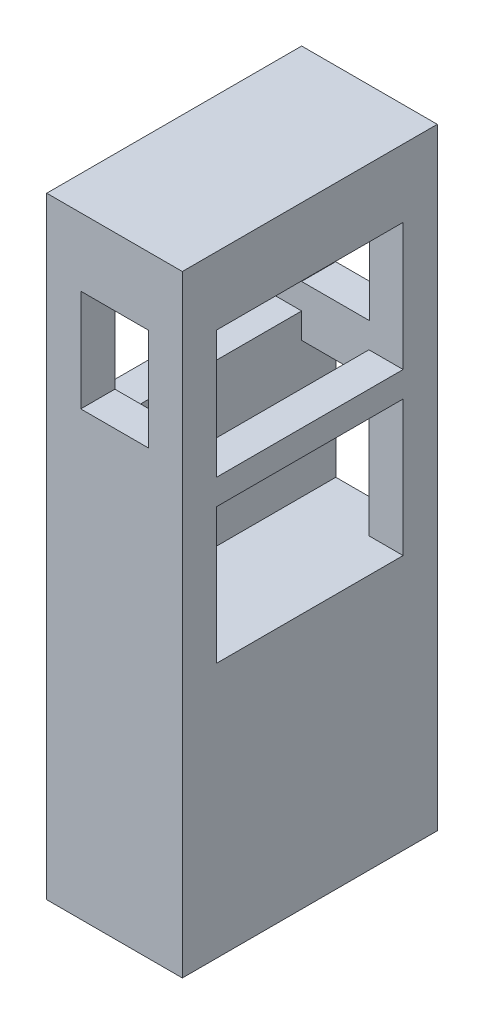
ISO-10303-21;
HEADER;
FILE_DESCRIPTION(('STEP AP214'),'2;1');
FILE_NAME('part.step','',(''),(''),'','','');
FILE_SCHEMA(('AUTOMOTIVE_DESIGN { 1 0 10303 214 1 1 1 1 }'));
ENDSEC;
DATA;
#1=APPLICATION_CONTEXT('core data for automotive mechanical design processes');
#2=APPLICATION_PROTOCOL_DEFINITION('international standard','automotive_design',2000,#1);
#3=PRODUCT_CONTEXT('',#1,'mechanical');
#4=PRODUCT('Part','Part','',(#3));
#5=PRODUCT_RELATED_PRODUCT_CATEGORY('part','',(#4));
#6=PRODUCT_DEFINITION_FORMATION('','',#4);
#7=PRODUCT_DEFINITION_CONTEXT('part definition',#1,'design');
#8=PRODUCT_DEFINITION('design','',#6,#7);
#9=PRODUCT_DEFINITION_SHAPE('','',#8);
#10=(LENGTH_UNIT() NAMED_UNIT(*) SI_UNIT(.MILLI.,.METRE.));
#11=(NAMED_UNIT(*) PLANE_ANGLE_UNIT() SI_UNIT($,.RADIAN.));
#12=(NAMED_UNIT(*) SI_UNIT($,.STERADIAN.) SOLID_ANGLE_UNIT());
#13=UNCERTAINTY_MEASURE_WITH_UNIT(LENGTH_MEASURE(1.E-05),#10,'distance_accuracy_value','');
#14=(GEOMETRIC_REPRESENTATION_CONTEXT(3) GLOBAL_UNCERTAINTY_ASSIGNED_CONTEXT((#13)) GLOBAL_UNIT_ASSIGNED_CONTEXT((#10,
#11,#12)) REPRESENTATION_CONTEXT('',''));
#15=CARTESIAN_POINT('',(0.,0.,0.));
#16=DIRECTION('',(0.,0.,1.));
#17=DIRECTION('',(1.,0.,0.));
#18=AXIS2_PLACEMENT_3D('',#15,#16,#17);
#19=CARTESIAN_POINT('',(667.5,10670.,0.));
#20=DIRECTION('',(0.,1.,0.));
#21=DIRECTION('',(0.,0.,1.));
#22=AXIS2_PLACEMENT_3D('',#19,#20,#21);
#23=PLANE('',#22);
#24=DIRECTION('',(-1.,0.,0.));
#25=VECTOR('',#24,1.);
#26=CARTESIAN_POINT('',(2460.,10670.,670.000000000001));
#27=LINE('',#26,#25);
#28=CARTESIAN_POINT('',(1997.5,10670.,670.000000000001));
#29=VERTEX_POINT('',#28);
#30=CARTESIAN_POINT('',(667.5,10670.,670.000000000001));
#31=VERTEX_POINT('',#30);
#32=EDGE_CURVE('E282',#29,#31,#27,.T.);
#33=ORIENTED_EDGE('',*,*,#32,.T.);
#34=DIRECTION('',(0.,0.,1.));
#35=VECTOR('',#34,1.);
#36=CARTESIAN_POINT('',(667.5,10670.,0.));
#37=LINE('',#36,#35);
#38=CARTESIAN_POINT('',(667.5,10670.,0.));
#39=VERTEX_POINT('',#38);
#40=EDGE_CURVE('E446',#39,#31,#37,.T.);
#41=ORIENTED_EDGE('',*,*,#40,.F.);
#42=DIRECTION('',(-1.,0.,0.));
#43=VECTOR('',#42,1.);
#44=CARTESIAN_POINT('',(667.5,10670.,0.));
#45=LINE('',#44,#43);
#46=CARTESIAN_POINT('',(1997.5,10670.,0.));
#47=VERTEX_POINT('',#46);
#48=EDGE_CURVE('E432',#47,#39,#45,.T.);
#49=ORIENTED_EDGE('',*,*,#48,.F.);
#50=DIRECTION('',(0.,0.,1.));
#51=VECTOR('',#50,1.);
#52=CARTESIAN_POINT('',(1997.5,10670.,0.));
#53=LINE('',#52,#51);
#54=EDGE_CURVE('E451',#47,#29,#53,.T.);
#55=ORIENTED_EDGE('',*,*,#54,.T.);
#56=EDGE_LOOP('',(#33,#41,#49,#55));
#57=FACE_BOUND('',#56,.T.);
#58=ADVANCED_FACE('F35',(#57),#23,.F.);
#59=DIRECTION('',(1.,0.,0.));
#60=VECTOR('',#59,1.);
#61=CARTESIAN_POINT('',(0.,10670.,670.000000000001));
#62=LINE('',#61,#60);
#63=CARTESIAN_POINT('',(0.,10670.,670.000000000001));
#64=VERTEX_POINT('',#63);
#65=CARTESIAN_POINT('',(200.,10670.,670.000000000001));
#66=VERTEX_POINT('',#65);
#67=EDGE_CURVE('E404',#64,#66,#62,.T.);
#68=ORIENTED_EDGE('',*,*,#67,.T.);
#69=DIRECTION('',(0.,0.,-1.));
#70=VECTOR('',#69,1.);
#71=CARTESIAN_POINT('',(200.,10670.,4330.));
#72=LINE('',#71,#70);
#73=CARTESIAN_POINT('',(200.,10670.,4330.));
#74=VERTEX_POINT('',#73);
#75=EDGE_CURVE('E298',#74,#66,#72,.T.);
#76=ORIENTED_EDGE('',*,*,#75,.F.);
#77=DIRECTION('',(1.,0.,0.));
#78=VECTOR('',#77,1.);
#79=CARTESIAN_POINT('',(0.,10670.,4330.));
#80=LINE('',#79,#78);
#81=CARTESIAN_POINT('',(0.,10670.,4330.));
#82=VERTEX_POINT('',#81);
#83=EDGE_CURVE('E400',#82,#74,#80,.T.);
#84=ORIENTED_EDGE('',*,*,#83,.F.);
#85=DIRECTION('',(0.,0.,-1.));
#86=VECTOR('',#85,1.);
#87=CARTESIAN_POINT('',(0.,10670.,4330.));
#88=LINE('',#87,#86);
#89=EDGE_CURVE('E378',#82,#64,#88,.T.);
#90=ORIENTED_EDGE('',*,*,#89,.T.);
#91=EDGE_LOOP('',(#68,#76,#84,#90));
#92=FACE_BOUND('',#91,.T.);
#93=ADVANCED_FACE('F529',(#92),#23,.F.);
#94=DIRECTION('',(0.,0.,-1.));
#95=VECTOR('',#94,1.);
#96=CARTESIAN_POINT('',(2460.,10670.,4330.));
#97=LINE('',#96,#95);
#98=CARTESIAN_POINT('',(2460.,10670.,4330.));
#99=VERTEX_POINT('',#98);
#100=CARTESIAN_POINT('',(2460.,10670.,670.000000000001));
#101=VERTEX_POINT('',#100);
#102=EDGE_CURVE('E58',#99,#101,#97,.T.);
#103=ORIENTED_EDGE('',*,*,#102,.T.);
#104=CARTESIAN_POINT('',(2660.,10670.,670.000000000001));
#105=VERTEX_POINT('',#104);
#106=EDGE_CURVE('E407',#101,#105,#62,.T.);
#107=ORIENTED_EDGE('',*,*,#106,.T.);
#108=DIRECTION('',(0.,0.,-1.));
#109=VECTOR('',#108,1.);
#110=CARTESIAN_POINT('',(2660.,10670.,4330.));
#111=LINE('',#110,#109);
#112=CARTESIAN_POINT('',(2660.,10670.,4330.));
#113=VERTEX_POINT('',#112);
#114=EDGE_CURVE('E390',#113,#105,#111,.T.);
#115=ORIENTED_EDGE('',*,*,#114,.F.);
#116=EDGE_CURVE('E403',#99,#113,#80,.T.);
#117=ORIENTED_EDGE('',*,*,#116,.F.);
#118=EDGE_LOOP('',(#103,#107,#115,#117));
#119=FACE_BOUND('',#118,.T.);
#120=ADVANCED_FACE('F518',(#119),#23,.F.);
#121=CARTESIAN_POINT('',(1990.,5510.,4330.));
#122=DIRECTION('',(1.,0.,0.));
#123=DIRECTION('',(0.,0.,-1.));
#124=AXIS2_PLACEMENT_3D('',#121,#122,#123);
#125=PLANE('',#124);
#126=DIRECTION('',(0.,1.,0.));
#127=VECTOR('',#126,1.);
#128=CARTESIAN_POINT('',(1990.,5510.,670.));
#129=LINE('',#128,#127);
#130=CARTESIAN_POINT('',(1990.,7670.,670.000000000001));
#131=VERTEX_POINT('',#130);
#132=CARTESIAN_POINT('',(1990.,8170.,670.));
#133=VERTEX_POINT('',#132);
#134=EDGE_CURVE('E363',#131,#133,#129,.T.);
#135=ORIENTED_EDGE('',*,*,#134,.F.);
#136=DIRECTION('',(0.,0.,1.));
#137=VECTOR('',#136,1.);
#138=CARTESIAN_POINT('',(1990.,7670.,670.000000000001));
#139=LINE('',#138,#137);
#140=CARTESIAN_POINT('',(1990.,7670.,4330.));
#141=VERTEX_POINT('',#140);
#142=EDGE_CURVE('E317',#131,#141,#139,.T.);
#143=ORIENTED_EDGE('',*,*,#142,.T.);
#144=DIRECTION('',(0.,1.,0.));
#145=VECTOR('',#144,1.);
#146=CARTESIAN_POINT('',(1990.,5510.,4330.));
#147=LINE('',#146,#145);
#148=CARTESIAN_POINT('',(1990.,8170.,4330.));
#149=VERTEX_POINT('',#148);
#150=EDGE_CURVE('E364',#141,#149,#147,.T.);
#151=ORIENTED_EDGE('',*,*,#150,.T.);
#152=DIRECTION('',(0.,0.,-1.));
#153=VECTOR('',#152,1.);
#154=CARTESIAN_POINT('',(1990.,8170.,4330.));
#155=LINE('',#154,#153);
#156=EDGE_CURVE('E357',#149,#133,#155,.T.);
#157=ORIENTED_EDGE('',*,*,#156,.T.);
#158=EDGE_LOOP('',(#135,#143,#151,#157));
#159=FACE_BOUND('',#158,.T.);
#160=ADVANCED_FACE('F532',(#159),#125,.F.);
#161=CARTESIAN_POINT('',(1990.,5010.,-1.2E-05));
#162=DIRECTION('',(0.,1.,0.));
#163=DIRECTION('',(0.,0.,1.));
#164=AXIS2_PLACEMENT_3D('',#161,#162,#163);
#165=PLANE('',#164);
#166=DIRECTION('',(-1.,0.,0.));
#167=VECTOR('',#166,1.);
#168=CARTESIAN_POINT('',(1990.,5010.,4330.));
#169=LINE('',#168,#167);
#170=CARTESIAN_POINT('',(2660.,5010.,4330.));
#171=VERTEX_POINT('',#170);
#172=CARTESIAN_POINT('',(670.,5010.,4330.));
#173=VERTEX_POINT('',#172);
#174=EDGE_CURVE('E341',#171,#173,#169,.T.);
#175=ORIENTED_EDGE('',*,*,#174,.F.);
#176=DIRECTION('',(0.,0.,1.));
#177=VECTOR('',#176,1.);
#178=CARTESIAN_POINT('',(2660.,5010.,670.000000000001));
#179=LINE('',#178,#177);
#180=CARTESIAN_POINT('',(2660.,5010.,670.000000000001));
#181=VERTEX_POINT('',#180);
#182=EDGE_CURVE('E327',#181,#171,#179,.T.);
#183=ORIENTED_EDGE('',*,*,#182,.F.);
#184=DIRECTION('',(1.,0.,0.));
#185=VECTOR('',#184,1.);
#186=CARTESIAN_POINT('',(1990.,5010.,670.000000000001));
#187=LINE('',#186,#185);
#188=CARTESIAN_POINT('',(1990.,5010.,670.000000000001));
#189=VERTEX_POINT('',#188);
#190=EDGE_CURVE('E324',#189,#181,#187,.T.);
#191=ORIENTED_EDGE('',*,*,#190,.F.);
#192=DIRECTION('',(0.,0.,1.));
#193=VECTOR('',#192,1.);
#194=CARTESIAN_POINT('',(1990.,5010.,-1.2E-05));
#195=LINE('',#194,#193);
#196=CARTESIAN_POINT('',(1990.,5010.,0.));
#197=VERTEX_POINT('',#196);
#198=EDGE_CURVE('E347',#197,#189,#195,.T.);
#199=ORIENTED_EDGE('',*,*,#198,.F.);
#200=DIRECTION('',(-1.,0.,0.));
#201=VECTOR('',#200,1.);
#202=CARTESIAN_POINT('',(0.,5010.,0.));
#203=LINE('',#202,#201);
#204=CARTESIAN_POINT('',(670.,5010.,0.));
#205=VERTEX_POINT('',#204);
#206=EDGE_CURVE('E11',#197,#205,#203,.T.);
#207=ORIENTED_EDGE('',*,*,#206,.T.);
#208=DIRECTION('',(0.,0.,-1.));
#209=VECTOR('',#208,1.);
#210=CARTESIAN_POINT('',(670.,5010.,4268.99999999999));
#211=LINE('',#210,#209);
#212=EDGE_CURVE('E334',#173,#205,#211,.T.);
#213=ORIENTED_EDGE('',*,*,#212,.F.);
#214=EDGE_LOOP('',(#175,#183,#191,#199,#207,#213));
#215=FACE_BOUND('',#214,.T.);
#216=ADVANCED_FACE('F538',(#215),#165,.T.);
#217=CARTESIAN_POINT('',(0.,0.,0.));
#218=DIRECTION('',(0.,0.,1.));
#219=DIRECTION('',(1.,0.,0.));
#220=AXIS2_PLACEMENT_3D('',#217,#218,#219);
#221=PLANE('',#220);
#222=DIRECTION('',(1.,0.,0.));
#223=VECTOR('',#222,1.);
#224=CARTESIAN_POINT('',(0.,12000.,0.));
#225=LINE('',#224,#223);
#226=CARTESIAN_POINT('',(0.,12000.,0.));
#227=VERTEX_POINT('',#226);
#228=CARTESIAN_POINT('',(2660.,12000.,0.));
#229=VERTEX_POINT('',#228);
#230=EDGE_CURVE('E449',#227,#229,#225,.T.);
#231=ORIENTED_EDGE('',*,*,#230,.T.);
#232=DIRECTION('',(0.,1.,0.));
#233=VECTOR('',#232,1.);
#234=CARTESIAN_POINT('',(2660.,0.,0.));
#235=LINE('',#234,#233);
#236=CARTESIAN_POINT('',(2660.,0.,0.));
#237=VERTEX_POINT('',#236);
#238=EDGE_CURVE('E476',#237,#229,#235,.T.);
#239=ORIENTED_EDGE('',*,*,#238,.F.);
#240=DIRECTION('',(1.,0.,0.));
#241=VECTOR('',#240,1.);
#242=CARTESIAN_POINT('',(0.,0.,0.));
#243=LINE('',#242,#241);
#244=CARTESIAN_POINT('',(0.,0.,0.));
#245=VERTEX_POINT('',#244);
#246=EDGE_CURVE('E479',#245,#237,#243,.T.);
#247=ORIENTED_EDGE('',*,*,#246,.F.);
#248=DIRECTION('',(0.,1.,0.));
#249=VECTOR('',#248,1.);
#250=CARTESIAN_POINT('',(0.,0.,0.));
#251=LINE('',#250,#249);
#252=EDGE_CURVE('E466',#245,#227,#251,.T.);
#253=ORIENTED_EDGE('',*,*,#252,.T.);
#254=EDGE_LOOP('',(#231,#239,#247,#253));
#255=FACE_BOUND('',#254,.T.);
#256=ORIENTED_EDGE('',*,*,#48,.T.);
#257=DIRECTION('',(0.,-1.,0.));
#258=VECTOR('',#257,1.);
#259=CARTESIAN_POINT('',(667.5,10670.,0.));
#260=LINE('',#259,#258);
#261=CARTESIAN_POINT('',(667.5,8670.,0.));
#262=VERTEX_POINT('',#261);
#263=EDGE_CURVE('E422',#39,#262,#260,.T.);
#264=ORIENTED_EDGE('',*,*,#263,.T.);
#265=DIRECTION('',(1.,0.,0.));
#266=VECTOR('',#265,1.);
#267=CARTESIAN_POINT('',(667.5,8670.,0.));
#268=LINE('',#267,#266);
#269=CARTESIAN_POINT('',(1997.5,8670.,0.));
#270=VERTEX_POINT('',#269);
#271=EDGE_CURVE('E425',#262,#270,#268,.T.);
#272=ORIENTED_EDGE('',*,*,#271,.T.);
#273=DIRECTION('',(0.,1.,0.));
#274=VECTOR('',#273,1.);
#275=CARTESIAN_POINT('',(1997.5,10670.,0.));
#276=LINE('',#275,#274);
#277=EDGE_CURVE('E429',#270,#47,#276,.T.);
#278=ORIENTED_EDGE('',*,*,#277,.T.);
#279=EDGE_LOOP('',(#256,#264,#272,#278));
#280=FACE_BOUND('',#279,.T.);
#281=DIRECTION('',(0.,-1.,0.));
#282=VECTOR('',#281,1.);
#283=CARTESIAN_POINT('',(1990.,-1.66116076616847E-13,0.));
#284=LINE('',#283,#282);
#285=CARTESIAN_POINT('',(1990.,7670.,0.));
#286=VERTEX_POINT('',#285);
#287=EDGE_CURVE('E350',#286,#197,#284,.T.);
#288=ORIENTED_EDGE('',*,*,#287,.F.);
#289=DIRECTION('',(1.,0.,0.));
#290=VECTOR('',#289,1.);
#291=CARTESIAN_POINT('',(0.,7670.,0.));
#292=LINE('',#291,#290);
#293=CARTESIAN_POINT('',(670.,7670.,0.));
#294=VERTEX_POINT('',#293);
#295=EDGE_CURVE('E355',#294,#286,#292,.T.);
#296=ORIENTED_EDGE('',*,*,#295,.F.);
#297=DIRECTION('',(0.,1.,0.));
#298=VECTOR('',#297,1.);
#299=CARTESIAN_POINT('',(670.,7670.,0.));
#300=LINE('',#299,#298);
#301=EDGE_CURVE('E337',#205,#294,#300,.T.);
#302=ORIENTED_EDGE('',*,*,#301,.F.);
#303=ORIENTED_EDGE('',*,*,#206,.F.);
#304=EDGE_LOOP('',(#288,#296,#302,#303));
#305=FACE_BOUND('',#304,.T.);
#306=ADVANCED_FACE('F615',(#255,#280,#305),#221,.F.);
#307=CARTESIAN_POINT('',(0.,10670.,670.000000000001));
#308=DIRECTION('',(0.,0.,1.));
#309=DIRECTION('',(0.,-1.,0.));
#310=AXIS2_PLACEMENT_3D('',#307,#308,#309);
#311=PLANE('',#310);
#312=DIRECTION('',(0.,-1.,0.));
#313=VECTOR('',#312,1.);
#314=CARTESIAN_POINT('',(200.,11670.,670.000000000001));
#315=LINE('',#314,#313);
#316=CARTESIAN_POINT('',(200.,11670.,670.000000000001));
#317=VERTEX_POINT('',#316);
#318=EDGE_CURVE('E309',#317,#66,#315,.T.);
#319=ORIENTED_EDGE('',*,*,#318,.T.);
#320=ORIENTED_EDGE('',*,*,#67,.F.);
#321=DIRECTION('',(0.,-1.,0.));
#322=VECTOR('',#321,1.);
#323=CARTESIAN_POINT('',(0.,10670.,670.000000000001));
#324=LINE('',#323,#322);
#325=CARTESIAN_POINT('',(0.,8170.,670.));
#326=VERTEX_POINT('',#325);
#327=EDGE_CURVE('E375',#64,#326,#324,.T.);
#328=ORIENTED_EDGE('',*,*,#327,.T.);
#329=DIRECTION('',(1.,0.,0.));
#330=VECTOR('',#329,1.);
#331=CARTESIAN_POINT('',(0.,8170.,670.));
#332=LINE('',#331,#330);
#333=CARTESIAN_POINT('',(670.,8170.,670.));
#334=VERTEX_POINT('',#333);
#335=EDGE_CURVE('E408',#326,#334,#332,.T.);
#336=ORIENTED_EDGE('',*,*,#335,.T.);
#337=DIRECTION('',(0.,1.,0.));
#338=VECTOR('',#337,1.);
#339=CARTESIAN_POINT('',(670.,5510.,670.));
#340=LINE('',#339,#338);
#341=CARTESIAN_POINT('',(670.,7670.,670.));
#342=VERTEX_POINT('',#341);
#343=EDGE_CURVE('E369',#342,#334,#340,.T.);
#344=ORIENTED_EDGE('',*,*,#343,.F.);
#345=DIRECTION('',(1.,0.,0.));
#346=VECTOR('',#345,1.);
#347=CARTESIAN_POINT('',(0.,7670.,670.));
#348=LINE('',#347,#346);
#349=EDGE_CURVE('E352',#342,#131,#348,.T.);
#350=ORIENTED_EDGE('',*,*,#349,.T.);
#351=ORIENTED_EDGE('',*,*,#134,.T.);
#352=CARTESIAN_POINT('',(2660.,8170.,670.));
#353=VERTEX_POINT('',#352);
#354=EDGE_CURVE('E384',#133,#353,#332,.T.);
#355=ORIENTED_EDGE('',*,*,#354,.T.);
#356=DIRECTION('',(0.,-1.,0.));
#357=VECTOR('',#356,1.);
#358=CARTESIAN_POINT('',(2660.,10670.,670.000000000001));
#359=LINE('',#358,#357);
#360=EDGE_CURVE('E387',#105,#353,#359,.T.);
#361=ORIENTED_EDGE('',*,*,#360,.F.);
#362=ORIENTED_EDGE('',*,*,#106,.F.);
#363=DIRECTION('',(0.,-1.,0.));
#364=VECTOR('',#363,1.);
#365=CARTESIAN_POINT('',(2460.,11670.,670.000000000001));
#366=LINE('',#365,#364);
#367=CARTESIAN_POINT('',(2460.,11670.,670.000000000001));
#368=VERTEX_POINT('',#367);
#369=EDGE_CURVE('E296',#368,#101,#366,.T.);
#370=ORIENTED_EDGE('',*,*,#369,.F.);
#371=DIRECTION('',(-1.,0.,0.));
#372=VECTOR('',#371,1.);
#373=CARTESIAN_POINT('',(2460.,11670.,670.000000000001));
#374=LINE('',#373,#372);
#375=EDGE_CURVE('E286',#368,#317,#374,.T.);
#376=ORIENTED_EDGE('',*,*,#375,.T.);
#377=EDGE_LOOP('',(#319,#320,#328,#336,#344,#350,#351,#355,#361,#362,#370,#376));
#378=FACE_BOUND('',#377,.T.);
#379=DIRECTION('',(0.,1.,0.));
#380=VECTOR('',#379,1.);
#381=CARTESIAN_POINT('',(667.5,10670.,670.000000000001));
#382=LINE('',#381,#380);
#383=CARTESIAN_POINT('',(667.5,8670.,670.));
#384=VERTEX_POINT('',#383);
#385=EDGE_CURVE('E412',#384,#31,#382,.T.);
#386=ORIENTED_EDGE('',*,*,#385,.T.);
#387=ORIENTED_EDGE('',*,*,#32,.F.);
#388=DIRECTION('',(0.,-1.,0.));
#389=VECTOR('',#388,1.);
#390=CARTESIAN_POINT('',(1997.5,10670.,670.000000000001));
#391=LINE('',#390,#389);
#392=CARTESIAN_POINT('',(1997.5,8670.,670.));
#393=VERTEX_POINT('',#392);
#394=EDGE_CURVE('E398',#29,#393,#391,.T.);
#395=ORIENTED_EDGE('',*,*,#394,.T.);
#396=DIRECTION('',(-1.,0.,0.));
#397=VECTOR('',#396,1.);
#398=CARTESIAN_POINT('',(667.5,8670.,670.));
#399=LINE('',#398,#397);
#400=EDGE_CURVE('E485',#393,#384,#399,.T.);
#401=ORIENTED_EDGE('',*,*,#400,.T.);
#402=EDGE_LOOP('',(#386,#387,#395,#401));
#403=FACE_BOUND('',#402,.T.);
#404=ADVANCED_FACE('F549',(#378,#403),#311,.T.);
#405=CARTESIAN_POINT('',(670.,5510.,4330.));
#406=DIRECTION('',(-1.,0.,0.));
#407=DIRECTION('',(0.,0.,1.));
#408=AXIS2_PLACEMENT_3D('',#405,#406,#407);
#409=PLANE('',#408);
#410=DIRECTION('',(0.,1.,0.));
#411=VECTOR('',#410,1.);
#412=CARTESIAN_POINT('',(670.,5510.,4330.));
#413=LINE('',#412,#411);
#414=CARTESIAN_POINT('',(670.,8170.,4330.));
#415=VERTEX_POINT('',#414);
#416=EDGE_CURVE('E367',#173,#415,#413,.T.);
#417=ORIENTED_EDGE('',*,*,#416,.F.);
#418=ORIENTED_EDGE('',*,*,#212,.T.);
#419=ORIENTED_EDGE('',*,*,#301,.T.);
#420=DIRECTION('',(0.,0.,1.));
#421=VECTOR('',#420,1.);
#422=CARTESIAN_POINT('',(670.,7670.,4268.99999999999));
#423=LINE('',#422,#421);
#424=EDGE_CURVE('E339',#294,#342,#423,.T.);
#425=ORIENTED_EDGE('',*,*,#424,.T.);
#426=ORIENTED_EDGE('',*,*,#343,.T.);
#427=DIRECTION('',(0.,0.,1.));
#428=VECTOR('',#427,1.);
#429=CARTESIAN_POINT('',(670.,8170.,4330.));
#430=LINE('',#429,#428);
#431=EDGE_CURVE('E360',#334,#415,#430,.T.);
#432=ORIENTED_EDGE('',*,*,#431,.T.);
#433=EDGE_LOOP('',(#417,#418,#419,#425,#426,#432));
#434=FACE_BOUND('',#433,.T.);
#435=ADVANCED_FACE('F584',(#434),#409,.F.);
#436=CARTESIAN_POINT('',(0.,8170.,4330.));
#437=DIRECTION('',(0.,-1.,0.));
#438=DIRECTION('',(0.,0.,-1.));
#439=AXIS2_PLACEMENT_3D('',#436,#437,#438);
#440=PLANE('',#439);
#441=ORIENTED_EDGE('',*,*,#354,.F.);
#442=ORIENTED_EDGE('',*,*,#156,.F.);
#443=DIRECTION('',(1.,0.,0.));
#444=VECTOR('',#443,1.);
#445=CARTESIAN_POINT('',(0.,8170.,4330.));
#446=LINE('',#445,#444);
#447=CARTESIAN_POINT('',(2660.,8170.,4330.));
#448=VERTEX_POINT('',#447);
#449=EDGE_CURVE('E399',#149,#448,#446,.T.);
#450=ORIENTED_EDGE('',*,*,#449,.T.);
#451=DIRECTION('',(0.,0.,-1.));
#452=VECTOR('',#451,1.);
#453=CARTESIAN_POINT('',(2660.,8170.,4330.));
#454=LINE('',#453,#452);
#455=EDGE_CURVE('E366',#448,#353,#454,.T.);
#456=ORIENTED_EDGE('',*,*,#455,.T.);
#457=EDGE_LOOP('',(#441,#442,#450,#456));
#458=FACE_BOUND('',#457,.T.);
#459=ADVANCED_FACE('F592',(#458),#440,.F.);
#460=CARTESIAN_POINT('',(667.5,10670.,0.));
#461=DIRECTION('',(-1.,0.,0.));
#462=DIRECTION('',(0.,-1.,0.));
#463=AXIS2_PLACEMENT_3D('',#460,#461,#462);
#464=PLANE('',#463);
#465=ORIENTED_EDGE('',*,*,#385,.F.);
#466=DIRECTION('',(0.,0.,1.));
#467=VECTOR('',#466,1.);
#468=CARTESIAN_POINT('',(667.5,8670.,0.));
#469=LINE('',#468,#467);
#470=EDGE_CURVE('E459',#262,#384,#469,.T.);
#471=ORIENTED_EDGE('',*,*,#470,.F.);
#472=ORIENTED_EDGE('',*,*,#263,.F.);
#473=ORIENTED_EDGE('',*,*,#40,.T.);
#474=EDGE_LOOP('',(#465,#471,#472,#473));
#475=FACE_BOUND('',#474,.T.);
#476=ADVANCED_FACE('F526',(#475),#464,.F.);
#477=CARTESIAN_POINT('',(1997.5,10670.,0.));
#478=DIRECTION('',(1.,0.,0.));
#479=DIRECTION('',(0.,1.,0.));
#480=AXIS2_PLACEMENT_3D('',#477,#478,#479);
#481=PLANE('',#480);
#482=ORIENTED_EDGE('',*,*,#394,.F.);
#483=ORIENTED_EDGE('',*,*,#54,.F.);
#484=ORIENTED_EDGE('',*,*,#277,.F.);
#485=DIRECTION('',(0.,0.,1.));
#486=VECTOR('',#485,1.);
#487=CARTESIAN_POINT('',(1997.5,8670.,0.));
#488=LINE('',#487,#486);
#489=EDGE_CURVE('E455',#270,#393,#488,.T.);
#490=ORIENTED_EDGE('',*,*,#489,.T.);
#491=EDGE_LOOP('',(#482,#483,#484,#490));
#492=FACE_BOUND('',#491,.T.);
#493=ADVANCED_FACE('F524',(#492),#481,.F.);
#494=CARTESIAN_POINT('',(667.5,8670.,0.));
#495=DIRECTION('',(0.,-1.,0.));
#496=DIRECTION('',(0.,0.,-1.));
#497=AXIS2_PLACEMENT_3D('',#494,#495,#496);
#498=PLANE('',#497);
#499=ORIENTED_EDGE('',*,*,#400,.F.);
#500=ORIENTED_EDGE('',*,*,#489,.F.);
#501=ORIENTED_EDGE('',*,*,#271,.F.);
#502=ORIENTED_EDGE('',*,*,#470,.T.);
#503=EDGE_LOOP('',(#499,#500,#501,#502));
#504=FACE_BOUND('',#503,.T.);
#505=ADVANCED_FACE('F613',(#504),#498,.F.);
#506=CARTESIAN_POINT('',(0.,12000.,5000.));
#507=DIRECTION('',(0.,1.,0.));
#508=DIRECTION('',(0.,0.,1.));
#509=AXIS2_PLACEMENT_3D('',#506,#507,#508);
#510=PLANE('',#509);
#511=ORIENTED_EDGE('',*,*,#230,.F.);
#512=DIRECTION('',(0.,0.,-1.));
#513=VECTOR('',#512,1.);
#514=CARTESIAN_POINT('',(0.,12000.,5000.));
#515=LINE('',#514,#513);
#516=CARTESIAN_POINT('',(0.,12000.,5000.));
#517=VERTEX_POINT('',#516);
#518=EDGE_CURVE('E483',#517,#227,#515,.T.);
#519=ORIENTED_EDGE('',*,*,#518,.F.);
#520=DIRECTION('',(1.,0.,0.));
#521=VECTOR('',#520,1.);
#522=CARTESIAN_POINT('',(0.,12000.,5000.));
#523=LINE('',#522,#521);
#524=CARTESIAN_POINT('',(2660.,12000.,5000.));
#525=VERTEX_POINT('',#524);
#526=EDGE_CURVE('E462',#517,#525,#523,.T.);
#527=ORIENTED_EDGE('',*,*,#526,.T.);
#528=DIRECTION('',(0.,0.,-1.));
#529=VECTOR('',#528,1.);
#530=CARTESIAN_POINT('',(2660.,12000.,5000.));
#531=LINE('',#530,#529);
#532=EDGE_CURVE('E473',#525,#229,#531,.T.);
#533=ORIENTED_EDGE('',*,*,#532,.T.);
#534=EDGE_LOOP('',(#511,#519,#527,#533));
#535=FACE_BOUND('',#534,.T.);
#536=ADVANCED_FACE('F37',(#535),#510,.T.);
#537=CARTESIAN_POINT('',(0.,0.,5000.));
#538=DIRECTION('',(-1.,0.,0.));
#539=DIRECTION('',(0.,0.,1.));
#540=AXIS2_PLACEMENT_3D('',#537,#538,#539);
#541=PLANE('',#540);
#542=DIRECTION('',(0.,0.,-1.));
#543=VECTOR('',#542,1.);
#544=CARTESIAN_POINT('',(0.,8170.,4330.));
#545=LINE('',#544,#543);
#546=CARTESIAN_POINT('',(0.,8170.,4330.));
#547=VERTEX_POINT('',#546);
#548=EDGE_CURVE('E372',#547,#326,#545,.T.);
#549=ORIENTED_EDGE('',*,*,#548,.T.);
#550=ORIENTED_EDGE('',*,*,#327,.F.);
#551=ORIENTED_EDGE('',*,*,#89,.F.);
#552=DIRECTION('',(0.,-1.,0.));
#553=VECTOR('',#552,1.);
#554=CARTESIAN_POINT('',(0.,10670.,4330.));
#555=LINE('',#554,#553);
#556=EDGE_CURVE('E381',#82,#547,#555,.T.);
#557=ORIENTED_EDGE('',*,*,#556,.T.);
#558=EDGE_LOOP('',(#549,#550,#551,#557));
#559=FACE_BOUND('',#558,.T.);
#560=ORIENTED_EDGE('',*,*,#252,.F.);
#561=DIRECTION('',(0.,0.,-1.));
#562=VECTOR('',#561,1.);
#563=CARTESIAN_POINT('',(0.,0.,5000.));
#564=LINE('',#563,#562);
#565=CARTESIAN_POINT('',(0.,0.,5000.));
#566=VERTEX_POINT('',#565);
#567=EDGE_CURVE('E486',#566,#245,#564,.T.);
#568=ORIENTED_EDGE('',*,*,#567,.F.);
#569=DIRECTION('',(0.,1.,0.));
#570=VECTOR('',#569,1.);
#571=CARTESIAN_POINT('',(0.,0.,5000.));
#572=LINE('',#571,#570);
#573=EDGE_CURVE('E470',#566,#517,#572,.T.);
#574=ORIENTED_EDGE('',*,*,#573,.T.);
#575=ORIENTED_EDGE('',*,*,#518,.T.);
#576=EDGE_LOOP('',(#560,#568,#574,#575));
#577=FACE_BOUND('',#576,.T.);
#578=ADVANCED_FACE('F579',(#559,#577),#541,.T.);
#579=CARTESIAN_POINT('',(0.,0.,5000.));
#580=DIRECTION('',(0.,1.,0.));
#581=DIRECTION('',(0.,0.,1.));
#582=AXIS2_PLACEMENT_3D('',#579,#580,#581);
#583=PLANE('',#582);
#584=DIRECTION('',(-1.,0.,0.));
#585=VECTOR('',#584,1.);
#586=CARTESIAN_POINT('',(2160.,0.,4500.));
#587=LINE('',#586,#585);
#588=CARTESIAN_POINT('',(2160.,0.,4500.));
#589=VERTEX_POINT('',#588);
#590=CARTESIAN_POINT('',(500.,0.,4500.));
#591=VERTEX_POINT('',#590);
#592=EDGE_CURVE('E276',#589,#591,#587,.T.);
#593=ORIENTED_EDGE('',*,*,#592,.F.);
#594=DIRECTION('',(0.,0.,1.));
#595=VECTOR('',#594,1.);
#596=CARTESIAN_POINT('',(2160.,0.,4500.));
#597=LINE('',#596,#595);
#598=CARTESIAN_POINT('',(2160.,0.,500.));
#599=VERTEX_POINT('',#598);
#600=EDGE_CURVE('E50',#599,#589,#597,.T.);
#601=ORIENTED_EDGE('',*,*,#600,.F.);
#602=DIRECTION('',(1.,0.,0.));
#603=VECTOR('',#602,1.);
#604=CARTESIAN_POINT('',(2160.,0.,500.));
#605=LINE('',#604,#603);
#606=CARTESIAN_POINT('',(500.,0.,500.));
#607=VERTEX_POINT('',#606);
#608=EDGE_CURVE('E267',#607,#599,#605,.T.);
#609=ORIENTED_EDGE('',*,*,#608,.F.);
#610=DIRECTION('',(0.,0.,-1.));
#611=VECTOR('',#610,1.);
#612=CARTESIAN_POINT('',(500.,0.,4500.));
#613=LINE('',#612,#611);
#614=EDGE_CURVE('E270',#591,#607,#613,.T.);
#615=ORIENTED_EDGE('',*,*,#614,.F.);
#616=EDGE_LOOP('',(#593,#601,#609,#615));
#617=FACE_BOUND('',#616,.T.);
#618=ORIENTED_EDGE('',*,*,#246,.T.);
#619=DIRECTION('',(0.,0.,-1.));
#620=VECTOR('',#619,1.);
#621=CARTESIAN_POINT('',(2660.,0.,5000.));
#622=LINE('',#621,#620);
#623=CARTESIAN_POINT('',(2660.,0.,5000.));
#624=VERTEX_POINT('',#623);
#625=EDGE_CURVE('E488',#624,#237,#622,.T.);
#626=ORIENTED_EDGE('',*,*,#625,.F.);
#627=DIRECTION('',(1.,0.,0.));
#628=VECTOR('',#627,1.);
#629=CARTESIAN_POINT('',(0.,0.,5000.));
#630=LINE('',#629,#628);
#631=EDGE_CURVE('E468',#566,#624,#630,.T.);
#632=ORIENTED_EDGE('',*,*,#631,.F.);
#633=ORIENTED_EDGE('',*,*,#567,.T.);
#634=EDGE_LOOP('',(#618,#626,#632,#633));
#635=FACE_BOUND('',#634,.T.);
#636=ADVANCED_FACE('F631',(#617,#635),#583,.F.);
#637=CARTESIAN_POINT('',(2660.,0.,5000.));
#638=DIRECTION('',(-1.,0.,0.));
#639=DIRECTION('',(0.,0.,1.));
#640=AXIS2_PLACEMENT_3D('',#637,#638,#639);
#641=PLANE('',#640);
#642=ORIENTED_EDGE('',*,*,#182,.T.);
#643=DIRECTION('',(0.,-1.,0.));
#644=VECTOR('',#643,1.);
#645=CARTESIAN_POINT('',(2660.,7670.,4330.));
#646=LINE('',#645,#644);
#647=CARTESIAN_POINT('',(2660.,7670.,4330.));
#648=VERTEX_POINT('',#647);
#649=EDGE_CURVE('E311',#648,#171,#646,.T.);
#650=ORIENTED_EDGE('',*,*,#649,.F.);
#651=DIRECTION('',(0.,0.,1.));
#652=VECTOR('',#651,1.);
#653=CARTESIAN_POINT('',(2660.,7670.,670.000000000001));
#654=LINE('',#653,#652);
#655=CARTESIAN_POINT('',(2660.,7670.,670.000000000001));
#656=VERTEX_POINT('',#655);
#657=EDGE_CURVE('E316',#656,#648,#654,.T.);
#658=ORIENTED_EDGE('',*,*,#657,.F.);
#659=DIRECTION('',(0.,1.,0.));
#660=VECTOR('',#659,1.);
#661=CARTESIAN_POINT('',(2660.,5010.,670.000000000001));
#662=LINE('',#661,#660);
#663=EDGE_CURVE('E321',#181,#656,#662,.T.);
#664=ORIENTED_EDGE('',*,*,#663,.F.);
#665=EDGE_LOOP('',(#642,#650,#658,#664));
#666=FACE_BOUND('',#665,.T.);
#667=ORIENTED_EDGE('',*,*,#360,.T.);
#668=ORIENTED_EDGE('',*,*,#455,.F.);
#669=DIRECTION('',(0.,-1.,0.));
#670=VECTOR('',#669,1.);
#671=CARTESIAN_POINT('',(2660.,10670.,4330.));
#672=LINE('',#671,#670);
#673=EDGE_CURVE('E376',#113,#448,#672,.T.);
#674=ORIENTED_EDGE('',*,*,#673,.F.);
#675=ORIENTED_EDGE('',*,*,#114,.T.);
#676=EDGE_LOOP('',(#667,#668,#674,#675));
#677=FACE_BOUND('',#676,.T.);
#678=ORIENTED_EDGE('',*,*,#238,.T.);
#679=ORIENTED_EDGE('',*,*,#532,.F.);
#680=DIRECTION('',(0.,1.,0.));
#681=VECTOR('',#680,1.);
#682=CARTESIAN_POINT('',(2660.,0.,5000.));
#683=LINE('',#682,#681);
#684=EDGE_CURVE('E465',#624,#525,#683,.T.);
#685=ORIENTED_EDGE('',*,*,#684,.F.);
#686=ORIENTED_EDGE('',*,*,#625,.T.);
#687=EDGE_LOOP('',(#678,#679,#685,#686));
#688=FACE_BOUND('',#687,.T.);
#689=ADVANCED_FACE('F556',(#666,#677,#688),#641,.F.);
#690=CARTESIAN_POINT('',(0.,0.,5000.));
#691=DIRECTION('',(0.,0.,1.));
#692=DIRECTION('',(1.,0.,0.));
#693=AXIS2_PLACEMENT_3D('',#690,#691,#692);
#694=PLANE('',#693);
#695=DIRECTION('',(0.,-1.,0.));
#696=VECTOR('',#695,1.);
#697=CARTESIAN_POINT('',(667.5,10670.,5000.));
#698=LINE('',#697,#696);
#699=CARTESIAN_POINT('',(667.5,10670.,5000.));
#700=VERTEX_POINT('',#699);
#701=CARTESIAN_POINT('',(667.5,8670.,5000.));
#702=VERTEX_POINT('',#701);
#703=EDGE_CURVE('E421',#700,#702,#698,.T.);
#704=ORIENTED_EDGE('',*,*,#703,.F.);
#705=DIRECTION('',(-1.,0.,0.));
#706=VECTOR('',#705,1.);
#707=CARTESIAN_POINT('',(667.5,10670.,5000.));
#708=LINE('',#707,#706);
#709=CARTESIAN_POINT('',(1997.5,10670.,5000.));
#710=VERTEX_POINT('',#709);
#711=EDGE_CURVE('E426',#710,#700,#708,.T.);
#712=ORIENTED_EDGE('',*,*,#711,.F.);
#713=DIRECTION('',(0.,1.,0.));
#714=VECTOR('',#713,1.);
#715=CARTESIAN_POINT('',(1997.5,10670.,5000.));
#716=LINE('',#715,#714);
#717=CARTESIAN_POINT('',(1997.5,8670.,5000.));
#718=VERTEX_POINT('',#717);
#719=EDGE_CURVE('E441',#718,#710,#716,.T.);
#720=ORIENTED_EDGE('',*,*,#719,.F.);
#721=DIRECTION('',(1.,0.,0.));
#722=VECTOR('',#721,1.);
#723=CARTESIAN_POINT('',(667.5,8670.,5000.));
#724=LINE('',#723,#722);
#725=EDGE_CURVE('E438',#702,#718,#724,.T.);
#726=ORIENTED_EDGE('',*,*,#725,.F.);
#727=EDGE_LOOP('',(#704,#712,#720,#726));
#728=FACE_BOUND('',#727,.T.);
#729=ORIENTED_EDGE('',*,*,#526,.F.);
#730=ORIENTED_EDGE('',*,*,#573,.F.);
#731=ORIENTED_EDGE('',*,*,#631,.T.);
#732=ORIENTED_EDGE('',*,*,#684,.T.);
#733=EDGE_LOOP('',(#729,#730,#731,#732));
#734=FACE_BOUND('',#733,.T.);
#735=ADVANCED_FACE('F507',(#728,#734),#694,.T.);
#736=CARTESIAN_POINT('',(667.5,8670.,4330.));
#737=VERTEX_POINT('',#736);
#738=EDGE_CURVE('E435',#737,#702,#469,.T.);
#739=ORIENTED_EDGE('',*,*,#738,.F.);
#740=DIRECTION('',(0.,1.,0.));
#741=VECTOR('',#740,1.);
#742=CARTESIAN_POINT('',(667.5,10670.,4330.));
#743=LINE('',#742,#741);
#744=CARTESIAN_POINT('',(667.5,10670.,4330.));
#745=VERTEX_POINT('',#744);
#746=EDGE_CURVE('E418',#737,#745,#743,.T.);
#747=ORIENTED_EDGE('',*,*,#746,.T.);
#748=EDGE_CURVE('E450',#745,#700,#37,.T.);
#749=ORIENTED_EDGE('',*,*,#748,.T.);
#750=ORIENTED_EDGE('',*,*,#703,.T.);
#751=EDGE_LOOP('',(#739,#747,#749,#750));
#752=FACE_BOUND('',#751,.T.);
#753=ADVANCED_FACE('F500',(#752),#464,.F.);
#754=ORIENTED_EDGE('',*,*,#748,.F.);
#755=DIRECTION('',(-1.,0.,0.));
#756=VECTOR('',#755,1.);
#757=CARTESIAN_POINT('',(2460.,10670.,4330.));
#758=LINE('',#757,#756);
#759=CARTESIAN_POINT('',(1997.5,10670.,4330.));
#760=VERTEX_POINT('',#759);
#761=EDGE_CURVE('E301',#760,#745,#758,.T.);
#762=ORIENTED_EDGE('',*,*,#761,.F.);
#763=EDGE_CURVE('E454',#760,#710,#53,.T.);
#764=ORIENTED_EDGE('',*,*,#763,.T.);
#765=ORIENTED_EDGE('',*,*,#711,.T.);
#766=EDGE_LOOP('',(#754,#762,#764,#765));
#767=FACE_BOUND('',#766,.T.);
#768=ADVANCED_FACE('F515',(#767),#23,.F.);
#769=ORIENTED_EDGE('',*,*,#763,.F.);
#770=DIRECTION('',(0.,-1.,0.));
#771=VECTOR('',#770,1.);
#772=CARTESIAN_POINT('',(1997.5,10670.,4330.));
#773=LINE('',#772,#771);
#774=CARTESIAN_POINT('',(1997.5,8670.,4330.));
#775=VERTEX_POINT('',#774);
#776=EDGE_CURVE('E415',#760,#775,#773,.T.);
#777=ORIENTED_EDGE('',*,*,#776,.T.);
#778=EDGE_CURVE('E458',#775,#718,#488,.T.);
#779=ORIENTED_EDGE('',*,*,#778,.T.);
#780=ORIENTED_EDGE('',*,*,#719,.T.);
#781=EDGE_LOOP('',(#769,#777,#779,#780));
#782=FACE_BOUND('',#781,.T.);
#783=ADVANCED_FACE('F511',(#782),#481,.F.);
#784=ORIENTED_EDGE('',*,*,#778,.F.);
#785=DIRECTION('',(-1.,0.,0.));
#786=VECTOR('',#785,1.);
#787=CARTESIAN_POINT('',(667.5,8670.,4330.));
#788=LINE('',#787,#786);
#789=EDGE_CURVE('E43',#775,#737,#788,.T.);
#790=ORIENTED_EDGE('',*,*,#789,.T.);
#791=ORIENTED_EDGE('',*,*,#738,.T.);
#792=ORIENTED_EDGE('',*,*,#725,.T.);
#793=EDGE_LOOP('',(#784,#790,#791,#792));
#794=FACE_BOUND('',#793,.T.);
#795=ADVANCED_FACE('F496',(#794),#498,.F.);
#796=CARTESIAN_POINT('',(0.,10670.,4330.));
#797=DIRECTION('',(0.,0.,1.));
#798=DIRECTION('',(1.,0.,0.));
#799=AXIS2_PLACEMENT_3D('',#796,#797,#798);
#800=PLANE('',#799);
#801=ORIENTED_EDGE('',*,*,#761,.T.);
#802=ORIENTED_EDGE('',*,*,#746,.F.);
#803=ORIENTED_EDGE('',*,*,#789,.F.);
#804=ORIENTED_EDGE('',*,*,#776,.F.);
#805=EDGE_LOOP('',(#801,#802,#803,#804));
#806=FACE_BOUND('',#805,.T.);
#807=ORIENTED_EDGE('',*,*,#174,.T.);
#808=ORIENTED_EDGE('',*,*,#416,.T.);
#809=EDGE_CURVE('E395',#547,#415,#446,.T.);
#810=ORIENTED_EDGE('',*,*,#809,.F.);
#811=ORIENTED_EDGE('',*,*,#556,.F.);
#812=ORIENTED_EDGE('',*,*,#83,.T.);
#813=DIRECTION('',(0.,-1.,0.));
#814=VECTOR('',#813,1.);
#815=CARTESIAN_POINT('',(200.,11670.,4330.));
#816=LINE('',#815,#814);
#817=CARTESIAN_POINT('',(200.,11670.,4330.));
#818=VERTEX_POINT('',#817);
#819=EDGE_CURVE('E307',#818,#74,#816,.T.);
#820=ORIENTED_EDGE('',*,*,#819,.F.);
#821=DIRECTION('',(-1.,0.,0.));
#822=VECTOR('',#821,1.);
#823=CARTESIAN_POINT('',(2460.,11670.,4330.));
#824=LINE('',#823,#822);
#825=CARTESIAN_POINT('',(2460.,11670.,4330.));
#826=VERTEX_POINT('',#825);
#827=EDGE_CURVE('E291',#826,#818,#824,.T.);
#828=ORIENTED_EDGE('',*,*,#827,.F.);
#829=DIRECTION('',(0.,-1.,0.));
#830=VECTOR('',#829,1.);
#831=CARTESIAN_POINT('',(2460.,11670.,4330.));
#832=LINE('',#831,#830);
#833=EDGE_CURVE('E305',#826,#99,#832,.T.);
#834=ORIENTED_EDGE('',*,*,#833,.T.);
#835=ORIENTED_EDGE('',*,*,#116,.T.);
#836=ORIENTED_EDGE('',*,*,#673,.T.);
#837=ORIENTED_EDGE('',*,*,#449,.F.);
#838=ORIENTED_EDGE('',*,*,#150,.F.);
#839=DIRECTION('',(1.,0.,0.));
#840=VECTOR('',#839,1.);
#841=CARTESIAN_POINT('',(2660.,7670.,4330.));
#842=LINE('',#841,#840);
#843=EDGE_CURVE('E314',#141,#648,#842,.T.);
#844=ORIENTED_EDGE('',*,*,#843,.T.);
#845=ORIENTED_EDGE('',*,*,#649,.T.);
#846=EDGE_LOOP('',(#807,#808,#810,#811,#812,#820,#828,#834,#835,#836,#837,#838,#844,#845));
#847=FACE_BOUND('',#846,.T.);
#848=ADVANCED_FACE('F512',(#806,#847),#800,.F.);
#849=ORIENTED_EDGE('',*,*,#809,.T.);
#850=ORIENTED_EDGE('',*,*,#431,.F.);
#851=ORIENTED_EDGE('',*,*,#335,.F.);
#852=ORIENTED_EDGE('',*,*,#548,.F.);
#853=EDGE_LOOP('',(#849,#850,#851,#852));
#854=FACE_BOUND('',#853,.T.);
#855=ADVANCED_FACE('F578',(#854),#440,.F.);
#856=ORIENTED_EDGE('',*,*,#198,.T.);
#857=DIRECTION('',(0.,1.,0.));
#858=VECTOR('',#857,1.);
#859=CARTESIAN_POINT('',(1990.,5010.,670.000000000001));
#860=LINE('',#859,#858);
#861=EDGE_CURVE('E320',#189,#131,#860,.T.);
#862=ORIENTED_EDGE('',*,*,#861,.T.);
#863=DIRECTION('',(0.,0.,1.));
#864=VECTOR('',#863,1.);
#865=CARTESIAN_POINT('',(1990.,7670.,-1.2E-05));
#866=LINE('',#865,#864);
#867=EDGE_CURVE('E344',#286,#131,#866,.T.);
#868=ORIENTED_EDGE('',*,*,#867,.F.);
#869=ORIENTED_EDGE('',*,*,#287,.T.);
#870=EDGE_LOOP('',(#856,#862,#868,#869));
#871=FACE_BOUND('',#870,.T.);
#872=ADVANCED_FACE('F541',(#871),#125,.F.);
#873=CARTESIAN_POINT('',(1990.,7670.,-1.2E-05));
#874=DIRECTION('',(0.,-1.,0.));
#875=DIRECTION('',(0.,0.,-1.));
#876=AXIS2_PLACEMENT_3D('',#873,#874,#875);
#877=PLANE('',#876);
#878=ORIENTED_EDGE('',*,*,#424,.F.);
#879=ORIENTED_EDGE('',*,*,#295,.T.);
#880=ORIENTED_EDGE('',*,*,#867,.T.);
#881=ORIENTED_EDGE('',*,*,#349,.F.);
#882=EDGE_LOOP('',(#878,#879,#880,#881));
#883=FACE_BOUND('',#882,.T.);
#884=ADVANCED_FACE('F606',(#883),#877,.T.);
#885=CARTESIAN_POINT('',(1990.,7670.,670.000000000001));
#886=DIRECTION('',(0.,1.,0.));
#887=DIRECTION('',(0.,0.,1.));
#888=AXIS2_PLACEMENT_3D('',#885,#886,#887);
#889=PLANE('',#888);
#890=ORIENTED_EDGE('',*,*,#657,.T.);
#891=ORIENTED_EDGE('',*,*,#843,.F.);
#892=ORIENTED_EDGE('',*,*,#142,.F.);
#893=DIRECTION('',(1.,0.,0.));
#894=VECTOR('',#893,1.);
#895=CARTESIAN_POINT('',(1990.,7670.,670.000000000001));
#896=LINE('',#895,#894);
#897=EDGE_CURVE('E332',#131,#656,#896,.T.);
#898=ORIENTED_EDGE('',*,*,#897,.T.);
#899=EDGE_LOOP('',(#890,#891,#892,#898));
#900=FACE_BOUND('',#899,.T.);
#901=ADVANCED_FACE('F646',(#900),#889,.F.);
#902=CARTESIAN_POINT('',(1990.,5010.,670.000000000001));
#903=DIRECTION('',(0.,0.,-1.));
#904=DIRECTION('',(-1.,0.,0.));
#905=AXIS2_PLACEMENT_3D('',#902,#903,#904);
#906=PLANE('',#905);
#907=ORIENTED_EDGE('',*,*,#663,.T.);
#908=ORIENTED_EDGE('',*,*,#897,.F.);
#909=ORIENTED_EDGE('',*,*,#861,.F.);
#910=ORIENTED_EDGE('',*,*,#190,.T.);
#911=EDGE_LOOP('',(#907,#908,#909,#910));
#912=FACE_BOUND('',#911,.T.);
#913=ADVANCED_FACE('F648',(#912),#906,.F.);
#914=CARTESIAN_POINT('',(200.,11670.,4330.));
#915=DIRECTION('',(-1.,0.,0.));
#916=DIRECTION('',(0.,0.,1.));
#917=AXIS2_PLACEMENT_3D('',#914,#915,#916);
#918=PLANE('',#917);
#919=ORIENTED_EDGE('',*,*,#75,.T.);
#920=ORIENTED_EDGE('',*,*,#318,.F.);
#921=DIRECTION('',(0.,0.,-1.));
#922=VECTOR('',#921,1.);
#923=CARTESIAN_POINT('',(200.,11670.,4330.));
#924=LINE('',#923,#922);
#925=EDGE_CURVE('E288',#818,#317,#924,.T.);
#926=ORIENTED_EDGE('',*,*,#925,.F.);
#927=ORIENTED_EDGE('',*,*,#819,.T.);
#928=EDGE_LOOP('',(#919,#920,#926,#927));
#929=FACE_BOUND('',#928,.T.);
#930=ADVANCED_FACE('F568',(#929),#918,.F.);
#931=CARTESIAN_POINT('',(2460.,11670.,4330.));
#932=DIRECTION('',(-1.,0.,0.));
#933=DIRECTION('',(0.,0.,1.));
#934=AXIS2_PLACEMENT_3D('',#931,#932,#933);
#935=PLANE('',#934);
#936=ORIENTED_EDGE('',*,*,#102,.F.);
#937=ORIENTED_EDGE('',*,*,#833,.F.);
#938=DIRECTION('',(0.,0.,-1.));
#939=VECTOR('',#938,1.);
#940=CARTESIAN_POINT('',(2460.,11670.,4330.));
#941=LINE('',#940,#939);
#942=EDGE_CURVE('E294',#826,#368,#941,.T.);
#943=ORIENTED_EDGE('',*,*,#942,.T.);
#944=ORIENTED_EDGE('',*,*,#369,.T.);
#945=EDGE_LOOP('',(#936,#937,#943,#944));
#946=FACE_BOUND('',#945,.T.);
#947=ADVANCED_FACE('F562',(#946),#935,.T.);
#948=CARTESIAN_POINT('',(0.,11670.,0.));
#949=DIRECTION('',(0.,-1.,0.));
#950=DIRECTION('',(0.,0.,-1.));
#951=AXIS2_PLACEMENT_3D('',#948,#949,#950);
#952=PLANE('',#951);
#953=ORIENTED_EDGE('',*,*,#375,.F.);
#954=ORIENTED_EDGE('',*,*,#942,.F.);
#955=ORIENTED_EDGE('',*,*,#827,.T.);
#956=ORIENTED_EDGE('',*,*,#925,.T.);
#957=EDGE_LOOP('',(#953,#954,#955,#956));
#958=FACE_BOUND('',#957,.T.);
#959=ADVANCED_FACE('F564',(#958),#952,.T.);
#960=CARTESIAN_POINT('',(2160.,4500.,4500.));
#961=DIRECTION('',(1.,0.,0.));
#962=DIRECTION('',(0.,0.,-1.));
#963=AXIS2_PLACEMENT_3D('',#960,#961,#962);
#964=PLANE('',#963);
#965=ORIENTED_EDGE('',*,*,#600,.T.);
#966=DIRECTION('',(0.,-1.,0.));
#967=VECTOR('',#966,1.);
#968=CARTESIAN_POINT('',(2160.,4500.,4500.));
#969=LINE('',#968,#967);
#970=CARTESIAN_POINT('',(2160.,4500.,4500.));
#971=VERTEX_POINT('',#970);
#972=EDGE_CURVE('E245',#971,#589,#969,.T.);
#973=ORIENTED_EDGE('',*,*,#972,.F.);
#974=DIRECTION('',(0.,0.,1.));
#975=VECTOR('',#974,1.);
#976=CARTESIAN_POINT('',(2160.,4500.,4500.));
#977=LINE('',#976,#975);
#978=CARTESIAN_POINT('',(2160.,4500.,500.));
#979=VERTEX_POINT('',#978);
#980=EDGE_CURVE('E249',#979,#971,#977,.T.);
#981=ORIENTED_EDGE('',*,*,#980,.F.);
#982=DIRECTION('',(0.,-1.,0.));
#983=VECTOR('',#982,1.);
#984=CARTESIAN_POINT('',(2160.,4500.,500.));
#985=LINE('',#984,#983);
#986=EDGE_CURVE('E280',#979,#599,#985,.T.);
#987=ORIENTED_EDGE('',*,*,#986,.T.);
#988=EDGE_LOOP('',(#965,#973,#981,#987));
#989=FACE_BOUND('',#988,.T.);
#990=ADVANCED_FACE('F247',(#989),#964,.F.);
#991=CARTESIAN_POINT('',(2160.,4500.,500.));
#992=DIRECTION('',(0.,0.,-1.));
#993=DIRECTION('',(-1.,0.,0.));
#994=AXIS2_PLACEMENT_3D('',#991,#992,#993);
#995=PLANE('',#994);
#996=ORIENTED_EDGE('',*,*,#608,.T.);
#997=ORIENTED_EDGE('',*,*,#986,.F.);
#998=DIRECTION('',(1.,0.,0.));
#999=VECTOR('',#998,1.);
#1000=CARTESIAN_POINT('',(2160.,4500.,500.));
#1001=LINE('',#1000,#999);
#1002=CARTESIAN_POINT('',(500.,4500.,500.));
#1003=VERTEX_POINT('',#1002);
#1004=EDGE_CURVE('E255',#1003,#979,#1001,.T.);
#1005=ORIENTED_EDGE('',*,*,#1004,.F.);
#1006=DIRECTION('',(0.,-1.,0.));
#1007=VECTOR('',#1006,1.);
#1008=CARTESIAN_POINT('',(500.,4500.,500.));
#1009=LINE('',#1008,#1007);
#1010=EDGE_CURVE('E283',#1003,#607,#1009,.T.);
#1011=ORIENTED_EDGE('',*,*,#1010,.T.);
#1012=EDGE_LOOP('',(#996,#997,#1005,#1011));
#1013=FACE_BOUND('',#1012,.T.);
#1014=ADVANCED_FACE('F672',(#1013),#995,.F.);
#1015=CARTESIAN_POINT('',(500.,4500.,4500.));
#1016=DIRECTION('',(-1.,0.,0.));
#1017=DIRECTION('',(0.,0.,1.));
#1018=AXIS2_PLACEMENT_3D('',#1015,#1016,#1017);
#1019=PLANE('',#1018);
#1020=ORIENTED_EDGE('',*,*,#614,.T.);
#1021=ORIENTED_EDGE('',*,*,#1010,.F.);
#1022=DIRECTION('',(0.,0.,-1.));
#1023=VECTOR('',#1022,1.);
#1024=CARTESIAN_POINT('',(500.,4500.,4500.));
#1025=LINE('',#1024,#1023);
#1026=CARTESIAN_POINT('',(500.,4500.,4500.));
#1027=VERTEX_POINT('',#1026);
#1028=EDGE_CURVE('E263',#1027,#1003,#1025,.T.);
#1029=ORIENTED_EDGE('',*,*,#1028,.F.);
#1030=DIRECTION('',(0.,-1.,0.));
#1031=VECTOR('',#1030,1.);
#1032=CARTESIAN_POINT('',(500.,4500.,4500.));
#1033=LINE('',#1032,#1031);
#1034=EDGE_CURVE('E254',#1027,#591,#1033,.T.);
#1035=ORIENTED_EDGE('',*,*,#1034,.T.);
#1036=EDGE_LOOP('',(#1020,#1021,#1029,#1035));
#1037=FACE_BOUND('',#1036,.T.);
#1038=ADVANCED_FACE('F675',(#1037),#1019,.F.);
#1039=CARTESIAN_POINT('',(2160.,4500.,4500.));
#1040=DIRECTION('',(0.,0.,1.));
#1041=DIRECTION('',(1.,0.,0.));
#1042=AXIS2_PLACEMENT_3D('',#1039,#1040,#1041);
#1043=PLANE('',#1042);
#1044=ORIENTED_EDGE('',*,*,#592,.T.);
#1045=ORIENTED_EDGE('',*,*,#1034,.F.);
#1046=DIRECTION('',(-1.,0.,0.));
#1047=VECTOR('',#1046,1.);
#1048=CARTESIAN_POINT('',(2160.,4500.,4500.));
#1049=LINE('',#1048,#1047);
#1050=EDGE_CURVE('E258',#971,#1027,#1049,.T.);
#1051=ORIENTED_EDGE('',*,*,#1050,.F.);
#1052=ORIENTED_EDGE('',*,*,#972,.T.);
#1053=EDGE_LOOP('',(#1044,#1045,#1051,#1052));
#1054=FACE_BOUND('',#1053,.T.);
#1055=ADVANCED_FACE('F259',(#1054),#1043,.F.);
#1056=CARTESIAN_POINT('',(0.,4500.,0.));
#1057=DIRECTION('',(0.,1.,0.));
#1058=DIRECTION('',(0.,0.,1.));
#1059=AXIS2_PLACEMENT_3D('',#1056,#1057,#1058);
#1060=PLANE('',#1059);
#1061=ORIENTED_EDGE('',*,*,#980,.T.);
#1062=ORIENTED_EDGE('',*,*,#1050,.T.);
#1063=ORIENTED_EDGE('',*,*,#1028,.T.);
#1064=ORIENTED_EDGE('',*,*,#1004,.T.);
#1065=EDGE_LOOP('',(#1061,#1062,#1063,#1064));
#1066=FACE_BOUND('',#1065,.T.);
#1067=ADVANCED_FACE('F265',(#1066),#1060,.F.);
#1068=CLOSED_SHELL('',(#58,#93,#120,#160,#216,#306,#404,#435,#459,#476,#493,#505,#536,#578,#636,
#689,#735,#753,#768,#783,#795,#848,#855,#872,#884,#901,#913,#930,#947,#959,#990,#1014,#1038,
#1055,#1067));
#1069=MANIFOLD_SOLID_BREP('B2',#1068);
#1070=ADVANCED_BREP_SHAPE_REPRESENTATION('',(#18,#1069),#14);
#1071=SHAPE_DEFINITION_REPRESENTATION(#9,#1070);
ENDSEC;
END-ISO-10303-21;
